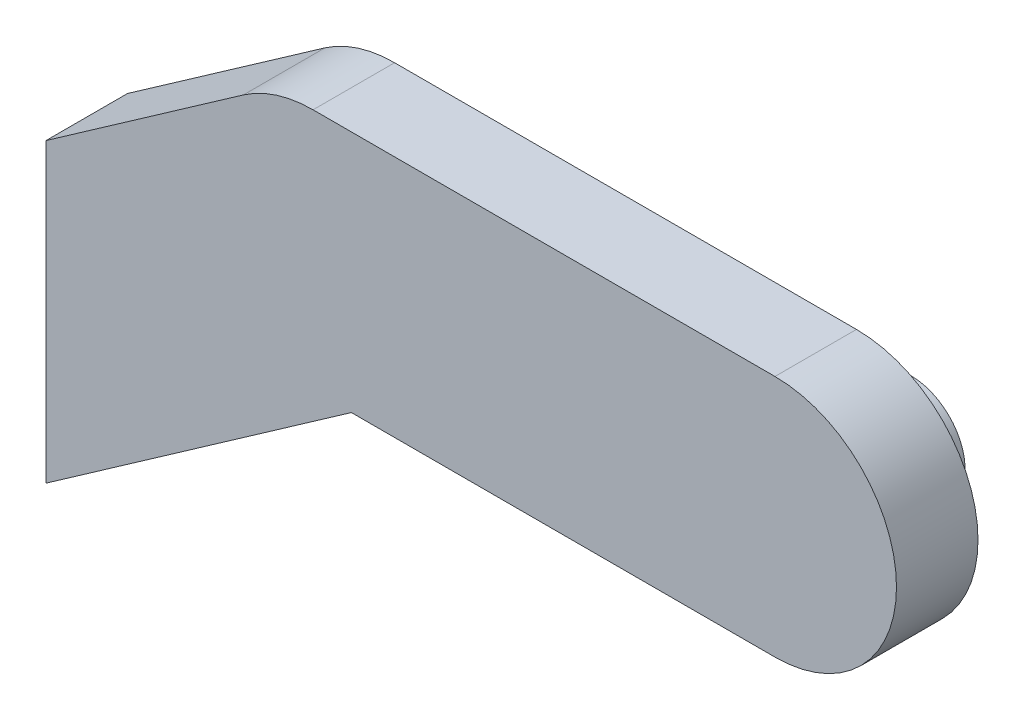
ISO-10303-21;
HEADER;
FILE_DESCRIPTION(('STEP AP214'),'2;1');
FILE_NAME('part.step','',(''),(''),'','','');
FILE_SCHEMA(('AUTOMOTIVE_DESIGN { 1 0 10303 214 1 1 1 1 }'));
ENDSEC;
DATA;
#1=APPLICATION_CONTEXT('core data for automotive mechanical design processes');
#2=APPLICATION_PROTOCOL_DEFINITION('international standard','automotive_design',2000,#1);
#3=PRODUCT_CONTEXT('',#1,'mechanical');
#4=PRODUCT('Part','Part','',(#3));
#5=PRODUCT_RELATED_PRODUCT_CATEGORY('part','',(#4));
#6=PRODUCT_DEFINITION_FORMATION('','',#4);
#7=PRODUCT_DEFINITION_CONTEXT('part definition',#1,'design');
#8=PRODUCT_DEFINITION('design','',#6,#7);
#9=PRODUCT_DEFINITION_SHAPE('','',#8);
#10=(LENGTH_UNIT() NAMED_UNIT(*) SI_UNIT(.MILLI.,.METRE.));
#11=(NAMED_UNIT(*) PLANE_ANGLE_UNIT() SI_UNIT($,.RADIAN.));
#12=(NAMED_UNIT(*) SI_UNIT($,.STERADIAN.) SOLID_ANGLE_UNIT());
#13=UNCERTAINTY_MEASURE_WITH_UNIT(LENGTH_MEASURE(1.E-05),#10,'distance_accuracy_value','');
#14=(GEOMETRIC_REPRESENTATION_CONTEXT(3) GLOBAL_UNCERTAINTY_ASSIGNED_CONTEXT((#13)) GLOBAL_UNIT_ASSIGNED_CONTEXT((#10,
#11,#12)) REPRESENTATION_CONTEXT('',''));
#15=CARTESIAN_POINT('',(0.,0.,0.));
#16=DIRECTION('',(0.,0.,1.));
#17=DIRECTION('',(1.,0.,0.));
#18=AXIS2_PLACEMENT_3D('',#15,#16,#17);
#19=CARTESIAN_POINT('',(0.,44.73,15.));
#20=DIRECTION('',(0.,-1.,0.));
#21=DIRECTION('',(0.,0.,-1.));
#22=AXIS2_PLACEMENT_3D('',#19,#20,#21);
#23=PLANE('',#22);
#24=DIRECTION('',(-1.,0.,0.));
#25=VECTOR('',#24,1.);
#26=CARTESIAN_POINT('',(0.,44.73,0.));
#27=LINE('',#26,#25);
#28=CARTESIAN_POINT('',(153.21162338788,44.73,0.));
#29=VERTEX_POINT('',#28);
#30=CARTESIAN_POINT('',(68.2116233878799,44.73,0.));
#31=VERTEX_POINT('',#30);
#32=EDGE_CURVE('E51',#29,#31,#27,.T.);
#33=ORIENTED_EDGE('',*,*,#32,.T.);
#34=DIRECTION('',(0.,0.,-1.));
#35=VECTOR('',#34,1.);
#36=CARTESIAN_POINT('',(68.2116233878799,44.73,96.5695927733488));
#37=LINE('',#36,#35);
#38=CARTESIAN_POINT('',(68.2116233878799,44.73,15.));
#39=VERTEX_POINT('',#38);
#40=EDGE_CURVE('E109',#39,#31,#37,.T.);
#41=ORIENTED_EDGE('',*,*,#40,.F.);
#42=DIRECTION('',(-1.,0.,0.));
#43=VECTOR('',#42,1.);
#44=CARTESIAN_POINT('',(0.,44.73,15.));
#45=LINE('',#44,#43);
#46=CARTESIAN_POINT('',(153.21162338788,44.73,15.));
#47=VERTEX_POINT('',#46);
#48=EDGE_CURVE('E11',#47,#39,#45,.T.);
#49=ORIENTED_EDGE('',*,*,#48,.F.);
#50=DIRECTION('',(0.,0.,1.));
#51=VECTOR('',#50,1.);
#52=CARTESIAN_POINT('',(153.21162338788,44.73,-0.000999999999999265));
#53=LINE('',#52,#51);
#54=EDGE_CURVE('E135',#29,#47,#53,.T.);
#55=ORIENTED_EDGE('',*,*,#54,.F.);
#56=EDGE_LOOP('',(#33,#41,#49,#55));
#57=FACE_BOUND('',#56,.T.);
#58=ADVANCED_FACE('F50',(#57),#23,.F.);
#59=CARTESIAN_POINT('',(0.,0.,15.));
#60=DIRECTION('',(0.,0.,-1.));
#61=DIRECTION('',(-1.,0.,0.));
#62=AXIS2_PLACEMENT_3D('',#59,#60,#61);
#63=PLANE('',#62);
#64=DIRECTION('',(0.819152044288991,0.573576436351047,0.));
#65=VECTOR('',#64,1.);
#66=CARTESIAN_POINT('',(55.3835863888887,40.6853354705233,15.));
#67=LINE('',#66,#65);
#68=CARTESIAN_POINT('',(19.0625007305404,15.2530374965872,15.));
#69=VERTEX_POINT('',#68);
#70=CARTESIAN_POINT('',(55.3835863888887,40.6853354705233,15.));
#71=VERTEX_POINT('',#70);
#72=EDGE_CURVE('E184',#69,#71,#67,.T.);
#73=ORIENTED_EDGE('',*,*,#72,.F.);
#74=DIRECTION('',(0.,1.,0.));
#75=VECTOR('',#74,1.);
#76=CARTESIAN_POINT('',(19.0625007305404,0.,15.));
#77=LINE('',#76,#75);
#78=CARTESIAN_POINT('',(19.0625007305404,-39.3522098587128,15.));
#79=VERTEX_POINT('',#78);
#80=EDGE_CURVE('E174',#79,#69,#77,.T.);
#81=ORIENTED_EDGE('',*,*,#80,.F.);
#82=DIRECTION('',(0.819152044288991,0.573576436351047,0.));
#83=VECTOR('',#82,1.);
#84=CARTESIAN_POINT('',(24.7608613571932,-35.3621747924932,15.));
#85=LINE('',#84,#83);
#86=CARTESIAN_POINT('',(75.2632808011584,0.,15.));
#87=VERTEX_POINT('',#86);
#88=EDGE_CURVE('E151',#79,#87,#85,.T.);
#89=ORIENTED_EDGE('',*,*,#88,.T.);
#90=DIRECTION('',(1.,0.,0.));
#91=VECTOR('',#90,1.);
#92=CARTESIAN_POINT('',(0.,0.,15.));
#93=LINE('',#92,#91);
#94=CARTESIAN_POINT('',(153.21162338788,0.,15.));
#95=VERTEX_POINT('',#94);
#96=EDGE_CURVE('E57',#87,#95,#93,.T.);
#97=ORIENTED_EDGE('',*,*,#96,.T.);
#98=CARTESIAN_POINT('',(153.21162338788,22.365,15.));
#99=DIRECTION('',(0.,0.,1.));
#100=DIRECTION('',(1.,0.,0.));
#101=AXIS2_PLACEMENT_3D('',#98,#99,#100);
#102=CIRCLE('',#101,22.365);
#103=EDGE_CURVE('E139',#95,#47,#102,.T.);
#104=ORIENTED_EDGE('',*,*,#103,.T.);
#105=ORIENTED_EDGE('',*,*,#48,.T.);
#106=CARTESIAN_POINT('',(68.2116233878799,22.365,15.));
#107=DIRECTION('',(0.,0.,-1.));
#108=DIRECTION('',(-1.,0.,0.));
#109=AXIS2_PLACEMENT_3D('',#106,#107,#108);
#110=CIRCLE('',#109,22.365);
#111=EDGE_CURVE('E120',#71,#39,#110,.T.);
#112=ORIENTED_EDGE('',*,*,#111,.F.);
#113=EDGE_LOOP('',(#73,#81,#89,#97,#104,#105,#112));
#114=FACE_BOUND('',#113,.T.);
#115=ADVANCED_FACE('F199',(#114),#63,.F.);
#116=CARTESIAN_POINT('',(0.,0.,0.));
#117=DIRECTION('',(0.,0.,-1.));
#118=DIRECTION('',(-1.,0.,0.));
#119=AXIS2_PLACEMENT_3D('',#116,#117,#118);
#120=PLANE('',#119);
#121=DIRECTION('',(0.,-1.,0.));
#122=VECTOR('',#121,1.);
#123=CARTESIAN_POINT('',(19.0625007305404,0.,0.));
#124=LINE('',#123,#122);
#125=CARTESIAN_POINT('',(19.0625007305404,15.2530374965872,0.));
#126=VERTEX_POINT('',#125);
#127=CARTESIAN_POINT('',(19.0625007305404,-39.3522098587128,0.));
#128=VERTEX_POINT('',#127);
#129=EDGE_CURVE('E182',#126,#128,#124,.T.);
#130=ORIENTED_EDGE('',*,*,#129,.F.);
#131=DIRECTION('',(-0.819152044288991,-0.573576436351047,0.));
#132=VECTOR('',#131,1.);
#133=CARTESIAN_POINT('',(55.3835863888887,40.6853354705233,0.));
#134=LINE('',#133,#132);
#135=CARTESIAN_POINT('',(55.3835863888887,40.6853354705233,0.));
#136=VERTEX_POINT('',#135);
#137=EDGE_CURVE('E125',#136,#126,#134,.T.);
#138=ORIENTED_EDGE('',*,*,#137,.F.);
#139=CARTESIAN_POINT('',(68.2116233878799,22.365,0.));
#140=DIRECTION('',(0.,0.,1.));
#141=DIRECTION('',(-1.,0.,0.));
#142=AXIS2_PLACEMENT_3D('',#139,#140,#141);
#143=CIRCLE('',#142,22.365);
#144=EDGE_CURVE('E112',#31,#136,#143,.T.);
#145=ORIENTED_EDGE('',*,*,#144,.F.);
#146=ORIENTED_EDGE('',*,*,#32,.F.);
#147=CARTESIAN_POINT('',(153.21162338788,22.365,0.));
#148=DIRECTION('',(0.,0.,-1.));
#149=DIRECTION('',(-1.,0.,0.));
#150=AXIS2_PLACEMENT_3D('',#147,#148,#149);
#151=CIRCLE('',#150,22.365);
#152=CARTESIAN_POINT('',(153.21162338788,0.,0.));
#153=VERTEX_POINT('',#152);
#154=EDGE_CURVE('E142',#153,#29,#151,.F.);
#155=ORIENTED_EDGE('',*,*,#154,.F.);
#156=DIRECTION('',(1.,0.,0.));
#157=VECTOR('',#156,1.);
#158=CARTESIAN_POINT('',(0.,0.,0.));
#159=LINE('',#158,#157);
#160=CARTESIAN_POINT('',(75.2632808011584,0.,0.));
#161=VERTEX_POINT('',#160);
#162=EDGE_CURVE('E73',#161,#153,#159,.T.);
#163=ORIENTED_EDGE('',*,*,#162,.F.);
#164=DIRECTION('',(-0.819152044288991,-0.573576436351047,0.));
#165=VECTOR('',#164,1.);
#166=CARTESIAN_POINT('',(24.7608613571932,-35.3621747924932,0.));
#167=LINE('',#166,#165);
#168=EDGE_CURVE('E179',#161,#128,#167,.T.);
#169=ORIENTED_EDGE('',*,*,#168,.T.);
#170=EDGE_LOOP('',(#130,#138,#145,#146,#155,#163,#169));
#171=FACE_BOUND('',#170,.T.);
#172=CARTESIAN_POINT('',(153.21162338788,22.365,0.));
#173=DIRECTION('',(0.,0.,-1.));
#174=DIRECTION('',(-1.,0.,0.));
#175=AXIS2_PLACEMENT_3D('',#172,#173,#174);
#176=CIRCLE('',#175,10.);
#177=CARTESIAN_POINT('',(143.21162338788,22.365,0.));
#178=VERTEX_POINT('',#177);
#179=EDGE_CURVE('E144',#178,#178,#176,.T.);
#180=ORIENTED_EDGE('',*,*,#179,.F.);
#181=EDGE_LOOP('',(#180));
#182=FACE_BOUND('',#181,.T.);
#183=ADVANCED_FACE('F126',(#171,#182),#120,.T.);
#184=CARTESIAN_POINT('',(0.,0.,15.));
#185=DIRECTION('',(0.,1.,0.));
#186=DIRECTION('',(0.,0.,1.));
#187=AXIS2_PLACEMENT_3D('',#184,#185,#186);
#188=PLANE('',#187);
#189=ORIENTED_EDGE('',*,*,#96,.F.);
#190=DIRECTION('',(0.,0.,-1.));
#191=VECTOR('',#190,1.);
#192=CARTESIAN_POINT('',(75.2632808011584,0.,192.669605183108));
#193=LINE('',#192,#191);
#194=EDGE_CURVE('E63',#87,#161,#193,.T.);
#195=ORIENTED_EDGE('',*,*,#194,.T.);
#196=ORIENTED_EDGE('',*,*,#162,.T.);
#197=DIRECTION('',(0.,0.,1.));
#198=VECTOR('',#197,1.);
#199=CARTESIAN_POINT('',(153.21162338788,0.,-0.000999999999999265));
#200=LINE('',#199,#198);
#201=EDGE_CURVE('E131',#153,#95,#200,.T.);
#202=ORIENTED_EDGE('',*,*,#201,.T.);
#203=EDGE_LOOP('',(#189,#195,#196,#202));
#204=FACE_BOUND('',#203,.T.);
#205=ADVANCED_FACE('F47',(#204),#188,.F.);
#206=CARTESIAN_POINT('',(153.21162338788,22.365,-0.000999999999999265));
#207=DIRECTION('',(0.,0.,1.));
#208=DIRECTION('',(1.,0.,0.));
#209=AXIS2_PLACEMENT_3D('',#206,#207,#208);
#210=CYLINDRICAL_SURFACE('',#209,22.365);
#211=ORIENTED_EDGE('',*,*,#154,.T.);
#212=ORIENTED_EDGE('',*,*,#54,.T.);
#213=ORIENTED_EDGE('',*,*,#103,.F.);
#214=ORIENTED_EDGE('',*,*,#201,.F.);
#215=EDGE_LOOP('',(#211,#212,#213,#214));
#216=FACE_BOUND('',#215,.T.);
#217=ADVANCED_FACE('F204',(#216),#210,.T.);
#218=CARTESIAN_POINT('',(153.21162338788,22.365,-10.));
#219=DIRECTION('',(0.,0.,1.));
#220=DIRECTION('',(1.,0.,0.));
#221=AXIS2_PLACEMENT_3D('',#218,#219,#220);
#222=CYLINDRICAL_SURFACE('',#221,10.);
#223=CARTESIAN_POINT('',(153.21162338788,22.365,-10.));
#224=DIRECTION('',(0.,0.,-1.));
#225=DIRECTION('',(-1.,0.,0.));
#226=AXIS2_PLACEMENT_3D('',#223,#224,#225);
#227=CIRCLE('',#226,10.);
#228=CARTESIAN_POINT('',(143.21162338788,22.365,-10.));
#229=VERTEX_POINT('',#228);
#230=EDGE_CURVE('E141',#229,#229,#227,.T.);
#231=ORIENTED_EDGE('',*,*,#230,.F.);
#232=EDGE_LOOP('',(#231));
#233=FACE_BOUND('',#232,.T.);
#234=ORIENTED_EDGE('',*,*,#179,.T.);
#235=EDGE_LOOP('',(#234));
#236=FACE_BOUND('',#235,.T.);
#237=ADVANCED_FACE('F230',(#233,#236),#222,.T.);
#238=CARTESIAN_POINT('',(0.,0.,-10.));
#239=DIRECTION('',(0.,0.,-1.));
#240=DIRECTION('',(-1.,0.,0.));
#241=AXIS2_PLACEMENT_3D('',#238,#239,#240);
#242=PLANE('',#241);
#243=CARTESIAN_POINT('',(153.21162338788,29.365,-10.));
#244=DIRECTION('',(0.,0.,-1.));
#245=DIRECTION('',(-1.,0.,0.));
#246=AXIS2_PLACEMENT_3D('',#243,#244,#245);
#247=CIRCLE('',#246,0.999999999999998);
#248=CARTESIAN_POINT('',(152.21162338788,29.365,-10.));
#249=VERTEX_POINT('',#248);
#250=EDGE_CURVE('E169',#249,#249,#247,.T.);
#251=ORIENTED_EDGE('',*,*,#250,.F.);
#252=EDGE_LOOP('',(#251));
#253=FACE_BOUND('',#252,.T.);
#254=CARTESIAN_POINT('',(146.21162338788,22.3650000000001,-10.));
#255=DIRECTION('',(0.,0.,-1.));
#256=DIRECTION('',(-1.,0.,0.));
#257=AXIS2_PLACEMENT_3D('',#254,#255,#256);
#258=CIRCLE('',#257,0.999999999999998);
#259=CARTESIAN_POINT('',(145.21162338788,22.3650000000001,-10.));
#260=VERTEX_POINT('',#259);
#261=EDGE_CURVE('E168',#260,#260,#258,.T.);
#262=ORIENTED_EDGE('',*,*,#261,.F.);
#263=EDGE_LOOP('',(#262));
#264=FACE_BOUND('',#263,.T.);
#265=CARTESIAN_POINT('',(153.21162338788,15.365,-10.));
#266=DIRECTION('',(0.,0.,-1.));
#267=DIRECTION('',(-1.,0.,0.));
#268=AXIS2_PLACEMENT_3D('',#265,#266,#267);
#269=CIRCLE('',#268,0.999999999999996);
#270=CARTESIAN_POINT('',(152.21162338788,15.365,-10.));
#271=VERTEX_POINT('',#270);
#272=EDGE_CURVE('E156',#271,#271,#269,.T.);
#273=ORIENTED_EDGE('',*,*,#272,.F.);
#274=EDGE_LOOP('',(#273));
#275=FACE_BOUND('',#274,.T.);
#276=CARTESIAN_POINT('',(160.21162338788,22.365,-10.));
#277=DIRECTION('',(0.,0.,-1.));
#278=DIRECTION('',(-1.,0.,0.));
#279=AXIS2_PLACEMENT_3D('',#276,#277,#278);
#280=CIRCLE('',#279,0.99999999999999);
#281=CARTESIAN_POINT('',(159.21162338788,22.365,-10.));
#282=VERTEX_POINT('',#281);
#283=EDGE_CURVE('E154',#282,#282,#280,.T.);
#284=ORIENTED_EDGE('',*,*,#283,.F.);
#285=EDGE_LOOP('',(#284));
#286=FACE_BOUND('',#285,.T.);
#287=ORIENTED_EDGE('',*,*,#230,.T.);
#288=EDGE_LOOP('',(#287));
#289=FACE_BOUND('',#288,.T.);
#290=ADVANCED_FACE('F235',(#253,#264,#275,#286,#289),#242,.T.);
#291=CARTESIAN_POINT('',(160.21162338788,22.365,-5.));
#292=DIRECTION('',(0.,0.,-1.));
#293=DIRECTION('',(-1.,0.,0.));
#294=AXIS2_PLACEMENT_3D('',#291,#292,#293);
#295=CYLINDRICAL_SURFACE('',#294,0.99999999999999);
#296=CARTESIAN_POINT('',(160.21162338788,22.365,-5.));
#297=DIRECTION('',(0.,0.,-1.));
#298=DIRECTION('',(-1.,0.,0.));
#299=AXIS2_PLACEMENT_3D('',#296,#297,#298);
#300=CIRCLE('',#299,0.99999999999999);
#301=CARTESIAN_POINT('',(159.21162338788,22.365,-5.));
#302=VERTEX_POINT('',#301);
#303=EDGE_CURVE('E150',#302,#302,#300,.T.);
#304=ORIENTED_EDGE('',*,*,#303,.F.);
#305=EDGE_LOOP('',(#304));
#306=FACE_BOUND('',#305,.T.);
#307=ORIENTED_EDGE('',*,*,#283,.T.);
#308=EDGE_LOOP('',(#307));
#309=FACE_BOUND('',#308,.T.);
#310=ADVANCED_FACE('F236',(#306,#309),#295,.F.);
#311=CARTESIAN_POINT('',(160.21162338788,22.365,-5.));
#312=DIRECTION('',(0.,0.,-1.));
#313=DIRECTION('',(-1.,0.,0.));
#314=AXIS2_PLACEMENT_3D('',#311,#312,#313);
#315=PLANE('',#314);
#316=ORIENTED_EDGE('',*,*,#303,.T.);
#317=EDGE_LOOP('',(#316));
#318=FACE_BOUND('',#317,.T.);
#319=ADVANCED_FACE('F238',(#318),#315,.T.);
#320=CARTESIAN_POINT('',(153.21162338788,15.365,-5.));
#321=DIRECTION('',(0.,0.,-1.));
#322=DIRECTION('',(-1.,0.,0.));
#323=AXIS2_PLACEMENT_3D('',#320,#321,#322);
#324=CYLINDRICAL_SURFACE('',#323,0.999999999999996);
#325=CARTESIAN_POINT('',(153.21162338788,15.365,-5.));
#326=DIRECTION('',(0.,0.,-1.));
#327=DIRECTION('',(-1.,0.,0.));
#328=AXIS2_PLACEMENT_3D('',#325,#326,#327);
#329=CIRCLE('',#328,0.999999999999996);
#330=CARTESIAN_POINT('',(152.21162338788,15.365,-5.));
#331=VERTEX_POINT('',#330);
#332=EDGE_CURVE('E159',#331,#331,#329,.T.);
#333=ORIENTED_EDGE('',*,*,#332,.F.);
#334=EDGE_LOOP('',(#333));
#335=FACE_BOUND('',#334,.T.);
#336=ORIENTED_EDGE('',*,*,#272,.T.);
#337=EDGE_LOOP('',(#336));
#338=FACE_BOUND('',#337,.T.);
#339=ADVANCED_FACE('F241',(#335,#338),#324,.F.);
#340=CARTESIAN_POINT('',(153.21162338788,15.365,-5.));
#341=DIRECTION('',(0.,0.,-1.));
#342=DIRECTION('',(-1.,0.,0.));
#343=AXIS2_PLACEMENT_3D('',#340,#341,#342);
#344=PLANE('',#343);
#345=ORIENTED_EDGE('',*,*,#332,.T.);
#346=EDGE_LOOP('',(#345));
#347=FACE_BOUND('',#346,.T.);
#348=ADVANCED_FACE('F246',(#347),#344,.T.);
#349=CARTESIAN_POINT('',(146.21162338788,22.3650000000001,-5.));
#350=DIRECTION('',(0.,0.,-1.));
#351=DIRECTION('',(-1.,0.,0.));
#352=AXIS2_PLACEMENT_3D('',#349,#350,#351);
#353=CYLINDRICAL_SURFACE('',#352,0.999999999999998);
#354=CARTESIAN_POINT('',(146.21162338788,22.3650000000001,-5.));
#355=DIRECTION('',(0.,0.,-1.));
#356=DIRECTION('',(-1.,0.,0.));
#357=AXIS2_PLACEMENT_3D('',#354,#355,#356);
#358=CIRCLE('',#357,0.999999999999998);
#359=CARTESIAN_POINT('',(145.21162338788,22.3650000000001,-5.));
#360=VERTEX_POINT('',#359);
#361=EDGE_CURVE('E161',#360,#360,#358,.T.);
#362=ORIENTED_EDGE('',*,*,#361,.F.);
#363=EDGE_LOOP('',(#362));
#364=FACE_BOUND('',#363,.T.);
#365=ORIENTED_EDGE('',*,*,#261,.T.);
#366=EDGE_LOOP('',(#365));
#367=FACE_BOUND('',#366,.T.);
#368=ADVANCED_FACE('F248',(#364,#367),#353,.F.);
#369=CARTESIAN_POINT('',(146.21162338788,22.3650000000001,-5.));
#370=DIRECTION('',(0.,0.,-1.));
#371=DIRECTION('',(-1.,0.,0.));
#372=AXIS2_PLACEMENT_3D('',#369,#370,#371);
#373=PLANE('',#372);
#374=ORIENTED_EDGE('',*,*,#361,.T.);
#375=EDGE_LOOP('',(#374));
#376=FACE_BOUND('',#375,.T.);
#377=ADVANCED_FACE('F251',(#376),#373,.T.);
#378=CARTESIAN_POINT('',(153.21162338788,29.365,-5.));
#379=DIRECTION('',(0.,0.,-1.));
#380=DIRECTION('',(-1.,0.,0.));
#381=AXIS2_PLACEMENT_3D('',#378,#379,#380);
#382=CYLINDRICAL_SURFACE('',#381,0.999999999999998);
#383=CARTESIAN_POINT('',(153.21162338788,29.365,-5.));
#384=DIRECTION('',(0.,0.,-1.));
#385=DIRECTION('',(-1.,0.,0.));
#386=AXIS2_PLACEMENT_3D('',#383,#384,#385);
#387=CIRCLE('',#386,0.999999999999998);
#388=CARTESIAN_POINT('',(152.21162338788,29.365,-5.));
#389=VERTEX_POINT('',#388);
#390=EDGE_CURVE('E147',#389,#389,#387,.T.);
#391=ORIENTED_EDGE('',*,*,#390,.F.);
#392=EDGE_LOOP('',(#391));
#393=FACE_BOUND('',#392,.T.);
#394=ORIENTED_EDGE('',*,*,#250,.T.);
#395=EDGE_LOOP('',(#394));
#396=FACE_BOUND('',#395,.T.);
#397=ADVANCED_FACE('F220',(#393,#396),#382,.F.);
#398=CARTESIAN_POINT('',(153.21162338788,29.365,-5.));
#399=DIRECTION('',(0.,0.,-1.));
#400=DIRECTION('',(-1.,0.,0.));
#401=AXIS2_PLACEMENT_3D('',#398,#399,#400);
#402=PLANE('',#401);
#403=ORIENTED_EDGE('',*,*,#390,.T.);
#404=EDGE_LOOP('',(#403));
#405=FACE_BOUND('',#404,.T.);
#406=ADVANCED_FACE('F206',(#405),#402,.T.);
#407=CARTESIAN_POINT('',(19.0625007305404,0.,192.669605183108));
#408=DIRECTION('',(1.,0.,0.));
#409=DIRECTION('',(0.,0.,-1.));
#410=AXIS2_PLACEMENT_3D('',#407,#408,#409);
#411=PLANE('',#410);
#412=ORIENTED_EDGE('',*,*,#80,.T.);
#413=DIRECTION('',(0.,0.,-1.));
#414=VECTOR('',#413,1.);
#415=CARTESIAN_POINT('',(19.0625007305404,15.2530374965872,96.5695927733488));
#416=LINE('',#415,#414);
#417=EDGE_CURVE('E189',#69,#126,#416,.T.);
#418=ORIENTED_EDGE('',*,*,#417,.T.);
#419=ORIENTED_EDGE('',*,*,#129,.T.);
#420=DIRECTION('',(0.,0.,-1.));
#421=VECTOR('',#420,1.);
#422=CARTESIAN_POINT('',(19.0625007305404,-39.3522098587128,192.669605183108));
#423=LINE('',#422,#421);
#424=EDGE_CURVE('E176',#79,#128,#423,.T.);
#425=ORIENTED_EDGE('',*,*,#424,.F.);
#426=EDGE_LOOP('',(#412,#418,#419,#425));
#427=FACE_BOUND('',#426,.T.);
#428=ADVANCED_FACE('F207',(#427),#411,.F.);
#429=CARTESIAN_POINT('',(24.7608613571932,-35.3621747924932,192.669605183108));
#430=DIRECTION('',(0.573576436351047,-0.819152044288991,0.));
#431=DIRECTION('',(0.819152044288991,0.573576436351047,0.));
#432=AXIS2_PLACEMENT_3D('',#429,#430,#431);
#433=PLANE('',#432);
#434=ORIENTED_EDGE('',*,*,#88,.F.);
#435=ORIENTED_EDGE('',*,*,#424,.T.);
#436=ORIENTED_EDGE('',*,*,#168,.F.);
#437=ORIENTED_EDGE('',*,*,#194,.F.);
#438=EDGE_LOOP('',(#434,#435,#436,#437));
#439=FACE_BOUND('',#438,.T.);
#440=ADVANCED_FACE('F202',(#439),#433,.T.);
#441=CARTESIAN_POINT('',(55.3835863888887,40.6853354705233,96.5695927733488));
#442=DIRECTION('',(0.573576436351047,-0.819152044288991,0.));
#443=DIRECTION('',(0.819152044288991,0.573576436351047,0.));
#444=AXIS2_PLACEMENT_3D('',#441,#442,#443);
#445=PLANE('',#444);
#446=ORIENTED_EDGE('',*,*,#72,.T.);
#447=DIRECTION('',(0.,0.,-1.));
#448=VECTOR('',#447,1.);
#449=CARTESIAN_POINT('',(55.3835863888887,40.6853354705233,96.5695927733488));
#450=LINE('',#449,#448);
#451=EDGE_CURVE('E122',#71,#136,#450,.T.);
#452=ORIENTED_EDGE('',*,*,#451,.T.);
#453=ORIENTED_EDGE('',*,*,#137,.T.);
#454=ORIENTED_EDGE('',*,*,#417,.F.);
#455=EDGE_LOOP('',(#446,#452,#453,#454));
#456=FACE_BOUND('',#455,.T.);
#457=ADVANCED_FACE('F197',(#456),#445,.F.);
#458=CARTESIAN_POINT('',(68.2116233878799,22.365,96.5695927733488));
#459=DIRECTION('',(0.,0.,-1.));
#460=DIRECTION('',(-1.,0.,0.));
#461=AXIS2_PLACEMENT_3D('',#458,#459,#460);
#462=CYLINDRICAL_SURFACE('',#461,22.365);
#463=ORIENTED_EDGE('',*,*,#111,.T.);
#464=ORIENTED_EDGE('',*,*,#40,.T.);
#465=ORIENTED_EDGE('',*,*,#144,.T.);
#466=ORIENTED_EDGE('',*,*,#451,.F.);
#467=EDGE_LOOP('',(#463,#464,#465,#466));
#468=FACE_BOUND('',#467,.T.);
#469=ADVANCED_FACE('F115',(#468),#462,.T.);
#470=CLOSED_SHELL('',(#58,#115,#183,#205,#217,#237,#290,#310,#319,#339,#348,#368,#377,#397,#406,
#428,#440,#457,#469));
#471=MANIFOLD_SOLID_BREP('B2',#470);
#472=ADVANCED_BREP_SHAPE_REPRESENTATION('',(#18,#471),#14);
#473=SHAPE_DEFINITION_REPRESENTATION(#9,#472);
ENDSEC;
END-ISO-10303-21;
